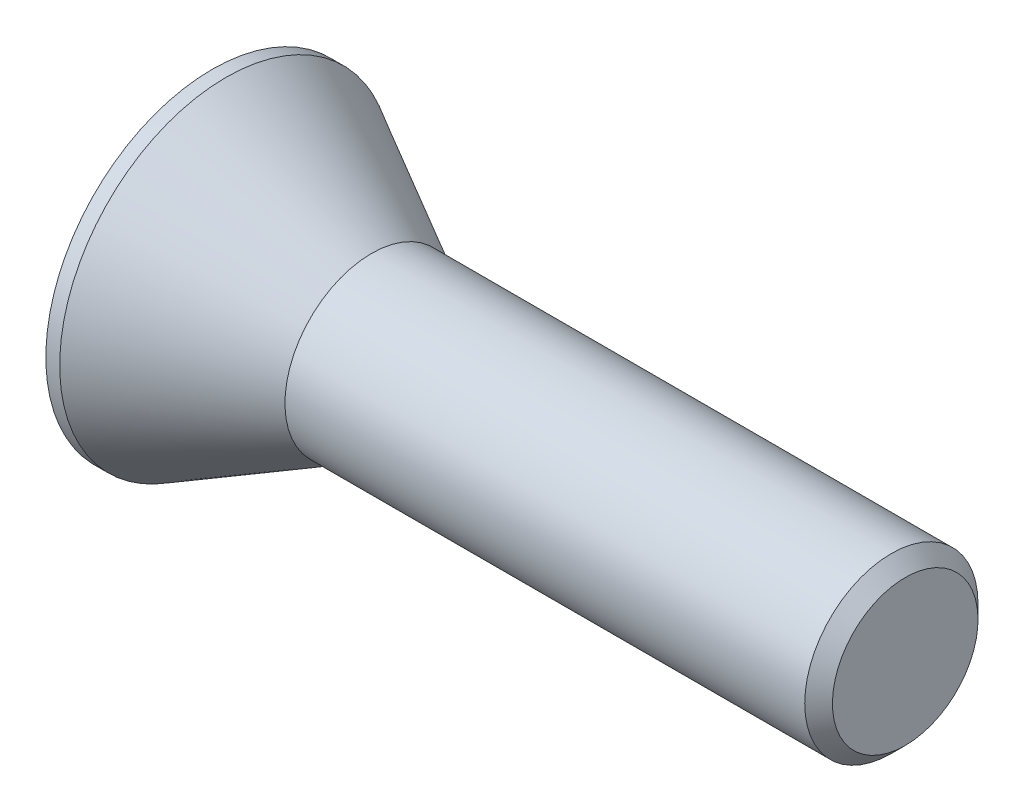
ISO-10303-21;
HEADER;
FILE_DESCRIPTION(('STEP AP214'),'2;1');
FILE_NAME('part.step','',(''),(''),'','','');
FILE_SCHEMA(('AUTOMOTIVE_DESIGN { 1 0 10303 214 1 1 1 1 }'));
ENDSEC;
DATA;
#1=APPLICATION_CONTEXT('core data for automotive mechanical design processes');
#2=APPLICATION_PROTOCOL_DEFINITION('international standard','automotive_design',2000,#1);
#3=PRODUCT_CONTEXT('',#1,'mechanical');
#4=PRODUCT('Part','Part','',(#3));
#5=PRODUCT_RELATED_PRODUCT_CATEGORY('part','',(#4));
#6=PRODUCT_DEFINITION_FORMATION('','',#4);
#7=PRODUCT_DEFINITION_CONTEXT('part definition',#1,'design');
#8=PRODUCT_DEFINITION('design','',#6,#7);
#9=PRODUCT_DEFINITION_SHAPE('','',#8);
#10=(LENGTH_UNIT() NAMED_UNIT(*) SI_UNIT(.MILLI.,.METRE.));
#11=(NAMED_UNIT(*) PLANE_ANGLE_UNIT() SI_UNIT($,.RADIAN.));
#12=(NAMED_UNIT(*) SI_UNIT($,.STERADIAN.) SOLID_ANGLE_UNIT());
#13=UNCERTAINTY_MEASURE_WITH_UNIT(LENGTH_MEASURE(1.E-05),#10,'distance_accuracy_value','');
#14=(GEOMETRIC_REPRESENTATION_CONTEXT(3) GLOBAL_UNCERTAINTY_ASSIGNED_CONTEXT((#13)) GLOBAL_UNIT_ASSIGNED_CONTEXT((#10,
#11,#12)) REPRESENTATION_CONTEXT('',''));
#15=CARTESIAN_POINT('',(0.,0.,0.));
#16=DIRECTION('',(0.,0.,1.));
#17=DIRECTION('',(1.,0.,0.));
#18=AXIS2_PLACEMENT_3D('',#15,#16,#17);
#19=CARTESIAN_POINT('',(0.,0.,0.));
#20=DIRECTION('',(1.,0.,0.));
#21=DIRECTION('',(0.,1.,0.));
#22=AXIS2_PLACEMENT_3D('',#19,#20,#21);
#23=PLANE('',#22);
#24=DIRECTION('',(0.,0.866025403784439,-0.5));
#25=VECTOR('',#24,1.);
#26=CARTESIAN_POINT('',(0.,0.,0.866025403784439));
#27=LINE('',#26,#25);
#28=CARTESIAN_POINT('',(0.,0.,0.866025403784439));
#29=VERTEX_POINT('',#28);
#30=CARTESIAN_POINT('',(0.,0.75,0.433012701892219));
#31=VERTEX_POINT('',#30);
#32=EDGE_CURVE('E144',#29,#31,#27,.T.);
#33=ORIENTED_EDGE('',*,*,#32,.F.);
#34=DIRECTION('',(0.,0.866025403784439,0.5));
#35=VECTOR('',#34,1.);
#36=CARTESIAN_POINT('',(0.,-0.75,0.43301270189222));
#37=LINE('',#36,#35);
#38=CARTESIAN_POINT('',(0.,-0.75,0.43301270189222));
#39=VERTEX_POINT('',#38);
#40=EDGE_CURVE('E64',#39,#29,#37,.T.);
#41=ORIENTED_EDGE('',*,*,#40,.F.);
#42=DIRECTION('',(0.,0.,1.));
#43=VECTOR('',#42,1.);
#44=CARTESIAN_POINT('',(0.,-0.75,-0.433012701892219));
#45=LINE('',#44,#43);
#46=CARTESIAN_POINT('',(0.,-0.75,-0.433012701892219));
#47=VERTEX_POINT('',#46);
#48=EDGE_CURVE('E157',#47,#39,#45,.T.);
#49=ORIENTED_EDGE('',*,*,#48,.F.);
#50=DIRECTION('',(0.,-0.866025403784438,0.5));
#51=VECTOR('',#50,1.);
#52=CARTESIAN_POINT('',(0.,0.,-0.866025403784439));
#53=LINE('',#52,#51);
#54=CARTESIAN_POINT('',(0.,0.,-0.866025403784439));
#55=VERTEX_POINT('',#54);
#56=EDGE_CURVE('E154',#55,#47,#53,.T.);
#57=ORIENTED_EDGE('',*,*,#56,.F.);
#58=DIRECTION('',(0.,-0.866025403784439,-0.5));
#59=VECTOR('',#58,1.);
#60=CARTESIAN_POINT('',(0.,0.75,-0.433012701892219));
#61=LINE('',#60,#59);
#62=CARTESIAN_POINT('',(0.,0.75,-0.433012701892219));
#63=VERTEX_POINT('',#62);
#64=EDGE_CURVE('E112',#63,#55,#61,.T.);
#65=ORIENTED_EDGE('',*,*,#64,.F.);
#66=DIRECTION('',(0.,0.,-1.));
#67=VECTOR('',#66,1.);
#68=CARTESIAN_POINT('',(0.,0.75,0.433012701892219));
#69=LINE('',#68,#67);
#70=EDGE_CURVE('E148',#31,#63,#69,.T.);
#71=ORIENTED_EDGE('',*,*,#70,.F.);
#72=EDGE_LOOP('',(#33,#41,#49,#57,#65,#71));
#73=FACE_BOUND('',#72,.T.);
#74=CARTESIAN_POINT('',(0.,0.,0.));
#75=DIRECTION('',(1.,0.,0.));
#76=DIRECTION('',(0.,1.,0.));
#77=AXIS2_PLACEMENT_3D('',#74,#75,#76);
#78=CIRCLE('',#77,2.4);
#79=CARTESIAN_POINT('',(0.,2.4,0.));
#80=VERTEX_POINT('',#79);
#81=EDGE_CURVE('E180',#80,#80,#78,.T.);
#82=ORIENTED_EDGE('',*,*,#81,.F.);
#83=EDGE_LOOP('',(#82));
#84=FACE_BOUND('',#83,.T.);
#85=ADVANCED_FACE('F47',(#73,#84),#23,.F.);
#86=CARTESIAN_POINT('',(10.,0.,0.));
#87=DIRECTION('',(1.,0.,0.));
#88=DIRECTION('',(0.,1.,0.));
#89=AXIS2_PLACEMENT_3D('',#86,#87,#88);
#90=CYLINDRICAL_SURFACE('',#89,2.4);
#91=CARTESIAN_POINT('',(0.200000000000001,0.,0.));
#92=DIRECTION('',(1.,0.,0.));
#93=DIRECTION('',(0.,1.,0.));
#94=AXIS2_PLACEMENT_3D('',#91,#92,#93);
#95=CIRCLE('',#94,2.4);
#96=CARTESIAN_POINT('',(0.200000000000001,2.4,0.));
#97=VERTEX_POINT('',#96);
#98=EDGE_CURVE('E176',#97,#97,#95,.T.);
#99=ORIENTED_EDGE('',*,*,#98,.F.);
#100=EDGE_LOOP('',(#99));
#101=FACE_BOUND('',#100,.T.);
#102=ORIENTED_EDGE('',*,*,#81,.T.);
#103=EDGE_LOOP('',(#102));
#104=FACE_BOUND('',#103,.T.);
#105=ADVANCED_FACE('F199',(#101,#104),#90,.T.);
#106=CARTESIAN_POINT('',(0.200000000000001,0.,0.));
#107=DIRECTION('',(-1.,0.,0.));
#108=DIRECTION('',(0.,-1.,0.));
#109=AXIS2_PLACEMENT_3D('',#106,#107,#108);
#110=CONICAL_SURFACE('',#109,2.4,0.50101338680359);
#111=CARTESIAN_POINT('',(2.3,0.,0.));
#112=DIRECTION('',(1.,0.,0.));
#113=DIRECTION('',(0.,1.,0.));
#114=AXIS2_PLACEMENT_3D('',#111,#112,#113);
#115=CIRCLE('',#114,1.25);
#116=CARTESIAN_POINT('',(2.3,1.25,0.));
#117=VERTEX_POINT('',#116);
#118=EDGE_CURVE('E163',#117,#117,#115,.T.);
#119=ORIENTED_EDGE('',*,*,#118,.F.);
#120=EDGE_LOOP('',(#119));
#121=FACE_BOUND('',#120,.T.);
#122=ORIENTED_EDGE('',*,*,#98,.T.);
#123=EDGE_LOOP('',(#122));
#124=FACE_BOUND('',#123,.T.);
#125=ADVANCED_FACE('F206',(#121,#124),#110,.T.);
#126=CARTESIAN_POINT('',(10.,0.,0.));
#127=DIRECTION('',(1.,0.,0.));
#128=DIRECTION('',(0.,1.,0.));
#129=AXIS2_PLACEMENT_3D('',#126,#127,#128);
#130=CYLINDRICAL_SURFACE('',#129,1.25);
#131=CARTESIAN_POINT('',(9.8,0.,0.));
#132=DIRECTION('',(-1.,0.,0.));
#133=DIRECTION('',(0.,-1.,0.));
#134=AXIS2_PLACEMENT_3D('',#131,#132,#133);
#135=CIRCLE('',#134,1.25);
#136=CARTESIAN_POINT('',(9.8,-1.25,0.));
#137=VERTEX_POINT('',#136);
#138=EDGE_CURVE('E11',#137,#137,#135,.T.);
#139=ORIENTED_EDGE('',*,*,#138,.T.);
#140=EDGE_LOOP('',(#139));
#141=FACE_BOUND('',#140,.T.);
#142=ORIENTED_EDGE('',*,*,#118,.T.);
#143=EDGE_LOOP('',(#142));
#144=FACE_BOUND('',#143,.T.);
#145=ADVANCED_FACE('F213',(#141,#144),#130,.T.);
#146=CARTESIAN_POINT('',(10.,-1.25,0.));
#147=DIRECTION('',(-1.,0.,0.));
#148=DIRECTION('',(0.,-1.,0.));
#149=AXIS2_PLACEMENT_3D('',#146,#147,#148);
#150=PLANE('',#149);
#151=CARTESIAN_POINT('',(10.,0.,0.));
#152=DIRECTION('',(-1.,0.,0.));
#153=DIRECTION('',(0.,-1.,0.));
#154=AXIS2_PLACEMENT_3D('',#151,#152,#153);
#155=CIRCLE('',#154,1.05);
#156=CARTESIAN_POINT('',(10.,-1.05,0.));
#157=VERTEX_POINT('',#156);
#158=EDGE_CURVE('E57',#157,#157,#155,.F.);
#159=ORIENTED_EDGE('',*,*,#158,.T.);
#160=EDGE_LOOP('',(#159));
#161=FACE_BOUND('',#160,.T.);
#162=ADVANCED_FACE('F187',(#161),#150,.F.);
#163=CARTESIAN_POINT('',(0.4,-0.75,0.43301270189222));
#164=DIRECTION('',(0.,-0.5,0.866025403784439));
#165=DIRECTION('',(0.,-0.866025403784439,-0.5));
#166=AXIS2_PLACEMENT_3D('',#163,#164,#165);
#167=PLANE('',#166);
#168=ORIENTED_EDGE('',*,*,#40,.T.);
#169=DIRECTION('',(-1.,0.,0.));
#170=VECTOR('',#169,1.);
#171=CARTESIAN_POINT('',(0.4,0.,0.866025403784439));
#172=LINE('',#171,#170);
#173=CARTESIAN_POINT('',(0.4,0.,0.866025403784439));
#174=VERTEX_POINT('',#173);
#175=EDGE_CURVE('E94',#174,#29,#172,.T.);
#176=ORIENTED_EDGE('',*,*,#175,.F.);
#177=DIRECTION('',(0.,0.866025403784439,0.5));
#178=VECTOR('',#177,1.);
#179=CARTESIAN_POINT('',(0.4,-0.75,0.43301270189222));
#180=LINE('',#179,#178);
#181=CARTESIAN_POINT('',(0.4,-0.75,0.43301270189222));
#182=VERTEX_POINT('',#181);
#183=EDGE_CURVE('E160',#182,#174,#180,.T.);
#184=ORIENTED_EDGE('',*,*,#183,.F.);
#185=DIRECTION('',(-1.,0.,0.));
#186=VECTOR('',#185,1.);
#187=CARTESIAN_POINT('',(0.4,-0.75,0.43301270189222));
#188=LINE('',#187,#186);
#189=EDGE_CURVE('E72',#182,#39,#188,.T.);
#190=ORIENTED_EDGE('',*,*,#189,.T.);
#191=EDGE_LOOP('',(#168,#176,#184,#190));
#192=FACE_BOUND('',#191,.T.);
#193=ADVANCED_FACE('F219',(#192),#167,.F.);
#194=CARTESIAN_POINT('',(0.4,-0.75,-0.433012701892219));
#195=DIRECTION('',(0.,-1.,0.));
#196=DIRECTION('',(1.,0.,0.));
#197=AXIS2_PLACEMENT_3D('',#194,#195,#196);
#198=PLANE('',#197);
#199=ORIENTED_EDGE('',*,*,#48,.T.);
#200=ORIENTED_EDGE('',*,*,#189,.F.);
#201=DIRECTION('',(0.,0.,1.));
#202=VECTOR('',#201,1.);
#203=CARTESIAN_POINT('',(0.4,-0.75,-0.433012701892219));
#204=LINE('',#203,#202);
#205=CARTESIAN_POINT('',(0.4,-0.75,-0.433012701892219));
#206=VERTEX_POINT('',#205);
#207=EDGE_CURVE('E126',#206,#182,#204,.T.);
#208=ORIENTED_EDGE('',*,*,#207,.F.);
#209=DIRECTION('',(-1.,0.,0.));
#210=VECTOR('',#209,1.);
#211=CARTESIAN_POINT('',(0.4,-0.75,-0.433012701892219));
#212=LINE('',#211,#210);
#213=EDGE_CURVE('E117',#206,#47,#212,.T.);
#214=ORIENTED_EDGE('',*,*,#213,.T.);
#215=EDGE_LOOP('',(#199,#200,#208,#214));
#216=FACE_BOUND('',#215,.T.);
#217=ADVANCED_FACE('F221',(#216),#198,.F.);
#218=CARTESIAN_POINT('',(0.4,0.,-0.866025403784439));
#219=DIRECTION('',(0.,-0.5,-0.866025403784438));
#220=DIRECTION('',(0.,0.866025403784438,-0.5));
#221=AXIS2_PLACEMENT_3D('',#218,#219,#220);
#222=PLANE('',#221);
#223=ORIENTED_EDGE('',*,*,#56,.T.);
#224=ORIENTED_EDGE('',*,*,#213,.F.);
#225=DIRECTION('',(0.,-0.866025403784438,0.5));
#226=VECTOR('',#225,1.);
#227=CARTESIAN_POINT('',(0.4,0.,-0.866025403784439));
#228=LINE('',#227,#226);
#229=CARTESIAN_POINT('',(0.4,0.,-0.866025403784439));
#230=VERTEX_POINT('',#229);
#231=EDGE_CURVE('E121',#230,#206,#228,.T.);
#232=ORIENTED_EDGE('',*,*,#231,.F.);
#233=DIRECTION('',(-1.,0.,0.));
#234=VECTOR('',#233,1.);
#235=CARTESIAN_POINT('',(0.4,0.,-0.866025403784439));
#236=LINE('',#235,#234);
#237=EDGE_CURVE('E105',#230,#55,#236,.T.);
#238=ORIENTED_EDGE('',*,*,#237,.T.);
#239=EDGE_LOOP('',(#223,#224,#232,#238));
#240=FACE_BOUND('',#239,.T.);
#241=ADVANCED_FACE('F122',(#240),#222,.F.);
#242=CARTESIAN_POINT('',(0.4,0.75,-0.433012701892219));
#243=DIRECTION('',(0.,0.5,-0.866025403784439));
#244=DIRECTION('',(0.,0.866025403784439,0.5));
#245=AXIS2_PLACEMENT_3D('',#242,#243,#244);
#246=PLANE('',#245);
#247=ORIENTED_EDGE('',*,*,#64,.T.);
#248=ORIENTED_EDGE('',*,*,#237,.F.);
#249=DIRECTION('',(0.,-0.866025403784439,-0.5));
#250=VECTOR('',#249,1.);
#251=CARTESIAN_POINT('',(0.4,0.75,-0.433012701892219));
#252=LINE('',#251,#250);
#253=CARTESIAN_POINT('',(0.4,0.75,-0.433012701892219));
#254=VERTEX_POINT('',#253);
#255=EDGE_CURVE('E109',#254,#230,#252,.T.);
#256=ORIENTED_EDGE('',*,*,#255,.F.);
#257=DIRECTION('',(-1.,0.,0.));
#258=VECTOR('',#257,1.);
#259=CARTESIAN_POINT('',(0.4,0.75,-0.433012701892219));
#260=LINE('',#259,#258);
#261=EDGE_CURVE('E118',#254,#63,#260,.T.);
#262=ORIENTED_EDGE('',*,*,#261,.T.);
#263=EDGE_LOOP('',(#247,#248,#256,#262));
#264=FACE_BOUND('',#263,.T.);
#265=ADVANCED_FACE('F107',(#264),#246,.F.);
#266=CARTESIAN_POINT('',(0.4,0.75,0.433012701892219));
#267=DIRECTION('',(0.,1.,0.));
#268=DIRECTION('',(-1.,0.,0.));
#269=AXIS2_PLACEMENT_3D('',#266,#267,#268);
#270=PLANE('',#269);
#271=ORIENTED_EDGE('',*,*,#70,.T.);
#272=ORIENTED_EDGE('',*,*,#261,.F.);
#273=DIRECTION('',(0.,0.,-1.));
#274=VECTOR('',#273,1.);
#275=CARTESIAN_POINT('',(0.4,0.75,0.433012701892219));
#276=LINE('',#275,#274);
#277=CARTESIAN_POINT('',(0.4,0.75,0.433012701892219));
#278=VERTEX_POINT('',#277);
#279=EDGE_CURVE('E132',#278,#254,#276,.T.);
#280=ORIENTED_EDGE('',*,*,#279,.F.);
#281=DIRECTION('',(-1.,0.,0.));
#282=VECTOR('',#281,1.);
#283=CARTESIAN_POINT('',(0.4,0.75,0.433012701892219));
#284=LINE('',#283,#282);
#285=EDGE_CURVE('E168',#278,#31,#284,.T.);
#286=ORIENTED_EDGE('',*,*,#285,.T.);
#287=EDGE_LOOP('',(#271,#272,#280,#286));
#288=FACE_BOUND('',#287,.T.);
#289=ADVANCED_FACE('F224',(#288),#270,.F.);
#290=CARTESIAN_POINT('',(0.4,0.,0.866025403784439));
#291=DIRECTION('',(0.,0.5,0.866025403784438));
#292=DIRECTION('',(0.,-0.866025403784439,0.5));
#293=AXIS2_PLACEMENT_3D('',#290,#291,#292);
#294=PLANE('',#293);
#295=ORIENTED_EDGE('',*,*,#32,.T.);
#296=ORIENTED_EDGE('',*,*,#285,.F.);
#297=DIRECTION('',(0.,0.866025403784439,-0.5));
#298=VECTOR('',#297,1.);
#299=CARTESIAN_POINT('',(0.4,0.,0.866025403784439));
#300=LINE('',#299,#298);
#301=EDGE_CURVE('E136',#174,#278,#300,.T.);
#302=ORIENTED_EDGE('',*,*,#301,.F.);
#303=ORIENTED_EDGE('',*,*,#175,.T.);
#304=EDGE_LOOP('',(#295,#296,#302,#303));
#305=FACE_BOUND('',#304,.T.);
#306=ADVANCED_FACE('F195',(#305),#294,.F.);
#307=CARTESIAN_POINT('',(0.4,0.,0.));
#308=DIRECTION('',(-1.,0.,0.));
#309=DIRECTION('',(0.,-1.,0.));
#310=AXIS2_PLACEMENT_3D('',#307,#308,#309);
#311=PLANE('',#310);
#312=ORIENTED_EDGE('',*,*,#183,.T.);
#313=ORIENTED_EDGE('',*,*,#301,.T.);
#314=ORIENTED_EDGE('',*,*,#279,.T.);
#315=ORIENTED_EDGE('',*,*,#255,.T.);
#316=ORIENTED_EDGE('',*,*,#231,.T.);
#317=ORIENTED_EDGE('',*,*,#207,.T.);
#318=EDGE_LOOP('',(#312,#313,#314,#315,#316,#317));
#319=FACE_BOUND('',#318,.T.);
#320=ADVANCED_FACE('F129',(#319),#311,.T.);
#321=CARTESIAN_POINT('',(10.,0.,0.));
#322=DIRECTION('',(-1.,0.,0.));
#323=DIRECTION('',(0.,-1.,0.));
#324=AXIS2_PLACEMENT_3D('',#321,#322,#323);
#325=CONICAL_SURFACE('',#324,1.05,0.785398163397449);
#326=ORIENTED_EDGE('',*,*,#138,.F.);
#327=EDGE_LOOP('',(#326));
#328=FACE_BOUND('',#327,.T.);
#329=ORIENTED_EDGE('',*,*,#158,.F.);
#330=EDGE_LOOP('',(#329));
#331=FACE_BOUND('',#330,.T.);
#332=ADVANCED_FACE('F50',(#328,#331),#325,.T.);
#333=CLOSED_SHELL('',(#85,#105,#125,#145,#162,#193,#217,#241,#265,#289,#306,#320,#332));
#334=MANIFOLD_SOLID_BREP('B2',#333);
#335=ADVANCED_BREP_SHAPE_REPRESENTATION('',(#18,#334),#14);
#336=SHAPE_DEFINITION_REPRESENTATION(#9,#335);
ENDSEC;
END-ISO-10303-21;
